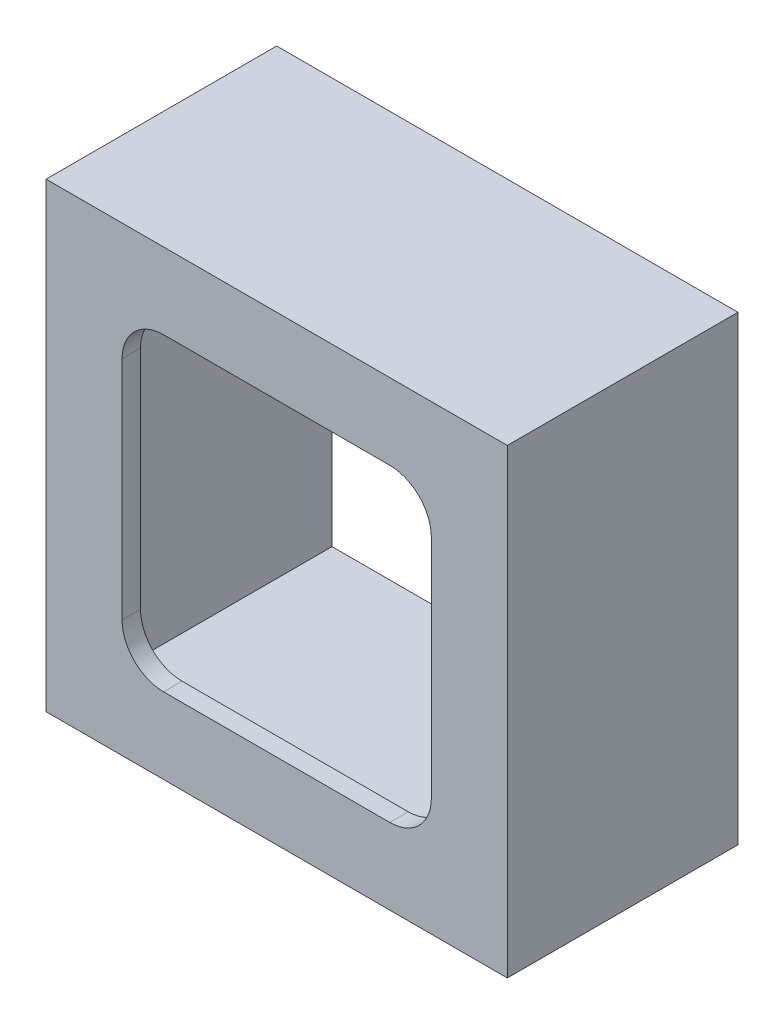
ISO-10303-21;
HEADER;
FILE_DESCRIPTION(('STEP AP214'),'2;1');
FILE_NAME('part.step','',(''),(''),'','','');
FILE_SCHEMA(('AUTOMOTIVE_DESIGN { 1 0 10303 214 1 1 1 1 }'));
ENDSEC;
DATA;
#1=APPLICATION_CONTEXT('core data for automotive mechanical design processes');
#2=APPLICATION_PROTOCOL_DEFINITION('international standard','automotive_design',2000,#1);
#3=PRODUCT_CONTEXT('',#1,'mechanical');
#4=PRODUCT('Part','Part','',(#3));
#5=PRODUCT_RELATED_PRODUCT_CATEGORY('part','',(#4));
#6=PRODUCT_DEFINITION_FORMATION('','',#4);
#7=PRODUCT_DEFINITION_CONTEXT('part definition',#1,'design');
#8=PRODUCT_DEFINITION('design','',#6,#7);
#9=PRODUCT_DEFINITION_SHAPE('','',#8);
#10=(LENGTH_UNIT() NAMED_UNIT(*) SI_UNIT(.MILLI.,.METRE.));
#11=(NAMED_UNIT(*) PLANE_ANGLE_UNIT() SI_UNIT($,.RADIAN.));
#12=(NAMED_UNIT(*) SI_UNIT($,.STERADIAN.) SOLID_ANGLE_UNIT());
#13=UNCERTAINTY_MEASURE_WITH_UNIT(LENGTH_MEASURE(1.E-05),#10,'distance_accuracy_value','');
#14=(GEOMETRIC_REPRESENTATION_CONTEXT(3) GLOBAL_UNCERTAINTY_ASSIGNED_CONTEXT((#13)) GLOBAL_UNIT_ASSIGNED_CONTEXT((#10,
#11,#12)) REPRESENTATION_CONTEXT('',''));
#15=CARTESIAN_POINT('',(0.,0.,0.));
#16=DIRECTION('',(0.,0.,1.));
#17=DIRECTION('',(1.,0.,0.));
#18=AXIS2_PLACEMENT_3D('',#15,#16,#17);
#19=CARTESIAN_POINT('',(25.,-25.,-72.7106781186548));
#20=DIRECTION('',(0.,-1.,0.));
#21=DIRECTION('',(0.,0.,-1.));
#22=AXIS2_PLACEMENT_3D('',#19,#20,#21);
#23=PLANE('',#22);
#24=DIRECTION('',(0.,0.,1.));
#25=VECTOR('',#24,1.);
#26=CARTESIAN_POINT('',(-25.,-25.,-72.7106781186548));
#27=LINE('',#26,#25);
#28=CARTESIAN_POINT('',(-25.,-25.,-25.));
#29=VERTEX_POINT('',#28);
#30=CARTESIAN_POINT('',(-25.,-25.,0.));
#31=VERTEX_POINT('',#30);
#32=EDGE_CURVE('E273',#29,#31,#27,.T.);
#33=ORIENTED_EDGE('',*,*,#32,.F.);
#34=DIRECTION('',(-1.,0.,0.));
#35=VECTOR('',#34,1.);
#36=CARTESIAN_POINT('',(25.,-25.,-25.));
#37=LINE('',#36,#35);
#38=CARTESIAN_POINT('',(25.,-25.,-25.));
#39=VERTEX_POINT('',#38);
#40=EDGE_CURVE('E195',#39,#29,#37,.T.);
#41=ORIENTED_EDGE('',*,*,#40,.F.);
#42=DIRECTION('',(0.,0.,1.));
#43=VECTOR('',#42,1.);
#44=CARTESIAN_POINT('',(25.,-25.,-72.7106781186548));
#45=LINE('',#44,#43);
#46=CARTESIAN_POINT('',(25.,-25.,0.));
#47=VERTEX_POINT('',#46);
#48=EDGE_CURVE('E278',#39,#47,#45,.T.);
#49=ORIENTED_EDGE('',*,*,#48,.T.);
#50=DIRECTION('',(1.,0.,0.));
#51=VECTOR('',#50,1.);
#52=CARTESIAN_POINT('',(25.,-25.,0.));
#53=LINE('',#52,#51);
#54=EDGE_CURVE('E264',#31,#47,#53,.T.);
#55=ORIENTED_EDGE('',*,*,#54,.F.);
#56=EDGE_LOOP('',(#33,#41,#49,#55));
#57=FACE_BOUND('',#56,.T.);
#58=ADVANCED_FACE('F39',(#57),#23,.T.);
#59=CARTESIAN_POINT('',(25.,25.,-72.7106781186548));
#60=DIRECTION('',(1.,0.,0.));
#61=DIRECTION('',(0.,0.,-1.));
#62=AXIS2_PLACEMENT_3D('',#59,#60,#61);
#63=PLANE('',#62);
#64=ORIENTED_EDGE('',*,*,#48,.F.);
#65=DIRECTION('',(0.,-1.,0.));
#66=VECTOR('',#65,1.);
#67=CARTESIAN_POINT('',(25.,25.,-25.));
#68=LINE('',#67,#66);
#69=CARTESIAN_POINT('',(25.,25.,-25.));
#70=VERTEX_POINT('',#69);
#71=EDGE_CURVE('E169',#70,#39,#68,.T.);
#72=ORIENTED_EDGE('',*,*,#71,.F.);
#73=DIRECTION('',(0.,0.,1.));
#74=VECTOR('',#73,1.);
#75=CARTESIAN_POINT('',(25.,25.,-72.7106781186548));
#76=LINE('',#75,#74);
#77=CARTESIAN_POINT('',(25.,25.,0.));
#78=VERTEX_POINT('',#77);
#79=EDGE_CURVE('E276',#70,#78,#76,.T.);
#80=ORIENTED_EDGE('',*,*,#79,.T.);
#81=DIRECTION('',(0.,1.,0.));
#82=VECTOR('',#81,1.);
#83=CARTESIAN_POINT('',(25.,25.,0.));
#84=LINE('',#83,#82);
#85=EDGE_CURVE('E267',#47,#78,#84,.T.);
#86=ORIENTED_EDGE('',*,*,#85,.F.);
#87=EDGE_LOOP('',(#64,#72,#80,#86));
#88=FACE_BOUND('',#87,.T.);
#89=ADVANCED_FACE('F295',(#88),#63,.T.);
#90=CARTESIAN_POINT('',(25.,25.,-72.7106781186548));
#91=DIRECTION('',(0.,1.,0.));
#92=DIRECTION('',(0.,0.,1.));
#93=AXIS2_PLACEMENT_3D('',#90,#91,#92);
#94=PLANE('',#93);
#95=ORIENTED_EDGE('',*,*,#79,.F.);
#96=DIRECTION('',(1.,0.,0.));
#97=VECTOR('',#96,1.);
#98=CARTESIAN_POINT('',(25.,25.,-25.));
#99=LINE('',#98,#97);
#100=CARTESIAN_POINT('',(-25.,25.,-25.));
#101=VERTEX_POINT('',#100);
#102=EDGE_CURVE('E201',#101,#70,#99,.T.);
#103=ORIENTED_EDGE('',*,*,#102,.F.);
#104=DIRECTION('',(0.,0.,1.));
#105=VECTOR('',#104,1.);
#106=CARTESIAN_POINT('',(-25.,25.,-72.7106781186548));
#107=LINE('',#106,#105);
#108=CARTESIAN_POINT('',(-25.,25.,0.));
#109=VERTEX_POINT('',#108);
#110=EDGE_CURVE('E274',#101,#109,#107,.T.);
#111=ORIENTED_EDGE('',*,*,#110,.T.);
#112=DIRECTION('',(-1.,0.,0.));
#113=VECTOR('',#112,1.);
#114=CARTESIAN_POINT('',(25.,25.,0.));
#115=LINE('',#114,#113);
#116=EDGE_CURVE('E270',#78,#109,#115,.T.);
#117=ORIENTED_EDGE('',*,*,#116,.F.);
#118=EDGE_LOOP('',(#95,#103,#111,#117));
#119=FACE_BOUND('',#118,.T.);
#120=ADVANCED_FACE('F290',(#119),#94,.T.);
#121=CARTESIAN_POINT('',(-25.,25.,-72.7106781186548));
#122=DIRECTION('',(-1.,0.,0.));
#123=DIRECTION('',(0.,0.,1.));
#124=AXIS2_PLACEMENT_3D('',#121,#122,#123);
#125=PLANE('',#124);
#126=ORIENTED_EDGE('',*,*,#110,.F.);
#127=DIRECTION('',(0.,1.,0.));
#128=VECTOR('',#127,1.);
#129=CARTESIAN_POINT('',(-25.,25.,-25.));
#130=LINE('',#129,#128);
#131=EDGE_CURVE('E198',#29,#101,#130,.T.);
#132=ORIENTED_EDGE('',*,*,#131,.F.);
#133=ORIENTED_EDGE('',*,*,#32,.T.);
#134=DIRECTION('',(0.,-1.,0.));
#135=VECTOR('',#134,1.);
#136=CARTESIAN_POINT('',(-25.,25.,0.));
#137=LINE('',#136,#135);
#138=EDGE_CURVE('E248',#109,#31,#137,.T.);
#139=ORIENTED_EDGE('',*,*,#138,.F.);
#140=EDGE_LOOP('',(#126,#132,#133,#139));
#141=FACE_BOUND('',#140,.T.);
#142=ADVANCED_FACE('F41',(#141),#125,.T.);
#143=CARTESIAN_POINT('',(0.,0.,0.));
#144=DIRECTION('',(0.,0.,-1.));
#145=DIRECTION('',(-1.,0.,0.));
#146=AXIS2_PLACEMENT_3D('',#143,#144,#145);
#147=PLANE('',#146);
#148=DIRECTION('',(0.,-1.,0.));
#149=VECTOR('',#148,1.);
#150=CARTESIAN_POINT('',(-16.7634559672906,12.2634559672906,0.));
#151=LINE('',#150,#149);
#152=CARTESIAN_POINT('',(-16.7634559672906,12.2634559672906,0.));
#153=VERTEX_POINT('',#152);
#154=CARTESIAN_POINT('',(-16.7634559672906,-12.2634559672906,0.));
#155=VERTEX_POINT('',#154);
#156=EDGE_CURVE('E224',#153,#155,#151,.T.);
#157=ORIENTED_EDGE('',*,*,#156,.F.);
#158=CARTESIAN_POINT('',(-12.2634559672906,12.2634559672906,0.));
#159=DIRECTION('',(0.,0.,1.));
#160=DIRECTION('',(1.,0.,0.));
#161=AXIS2_PLACEMENT_3D('',#158,#159,#160);
#162=CIRCLE('',#161,4.5);
#163=CARTESIAN_POINT('',(-12.2634559672906,16.7634559672906,0.));
#164=VERTEX_POINT('',#163);
#165=EDGE_CURVE('E203',#164,#153,#162,.T.);
#166=ORIENTED_EDGE('',*,*,#165,.F.);
#167=DIRECTION('',(-1.,0.,0.));
#168=VECTOR('',#167,1.);
#169=CARTESIAN_POINT('',(12.2634559672906,16.7634559672906,0.));
#170=LINE('',#169,#168);
#171=CARTESIAN_POINT('',(12.2634559672906,16.7634559672906,0.));
#172=VERTEX_POINT('',#171);
#173=EDGE_CURVE('E242',#172,#164,#170,.T.);
#174=ORIENTED_EDGE('',*,*,#173,.F.);
#175=CARTESIAN_POINT('',(12.2634559672906,12.2634559672906,0.));
#176=DIRECTION('',(0.,0.,1.));
#177=DIRECTION('',(1.,0.,0.));
#178=AXIS2_PLACEMENT_3D('',#175,#176,#177);
#179=CIRCLE('',#178,4.5);
#180=CARTESIAN_POINT('',(16.7634559672906,12.2634559672906,0.));
#181=VERTEX_POINT('',#180);
#182=EDGE_CURVE('E239',#181,#172,#179,.T.);
#183=ORIENTED_EDGE('',*,*,#182,.F.);
#184=DIRECTION('',(0.,1.,0.));
#185=VECTOR('',#184,1.);
#186=CARTESIAN_POINT('',(16.7634559672906,-12.2634559672906,0.));
#187=LINE('',#186,#185);
#188=CARTESIAN_POINT('',(16.7634559672906,-12.2634559672906,0.));
#189=VERTEX_POINT('',#188);
#190=EDGE_CURVE('E236',#189,#181,#187,.T.);
#191=ORIENTED_EDGE('',*,*,#190,.F.);
#192=CARTESIAN_POINT('',(12.2634559672906,-12.2634559672906,0.));
#193=DIRECTION('',(0.,0.,1.));
#194=DIRECTION('',(1.,0.,0.));
#195=AXIS2_PLACEMENT_3D('',#192,#193,#194);
#196=CIRCLE('',#195,4.5);
#197=CARTESIAN_POINT('',(12.2634559672906,-16.7634559672906,0.));
#198=VERTEX_POINT('',#197);
#199=EDGE_CURVE('E233',#198,#189,#196,.T.);
#200=ORIENTED_EDGE('',*,*,#199,.F.);
#201=DIRECTION('',(1.,0.,0.));
#202=VECTOR('',#201,1.);
#203=CARTESIAN_POINT('',(-12.2634559672906,-16.7634559672906,0.));
#204=LINE('',#203,#202);
#205=CARTESIAN_POINT('',(-12.2634559672906,-16.7634559672906,0.));
#206=VERTEX_POINT('',#205);
#207=EDGE_CURVE('E230',#206,#198,#204,.T.);
#208=ORIENTED_EDGE('',*,*,#207,.F.);
#209=CARTESIAN_POINT('',(-12.2634559672906,-12.2634559672906,0.));
#210=DIRECTION('',(0.,0.,1.));
#211=DIRECTION('',(1.,0.,0.));
#212=AXIS2_PLACEMENT_3D('',#209,#210,#211);
#213=CIRCLE('',#212,4.5);
#214=EDGE_CURVE('E227',#155,#206,#213,.T.);
#215=ORIENTED_EDGE('',*,*,#214,.F.);
#216=EDGE_LOOP('',(#157,#166,#174,#183,#191,#200,#208,#215));
#217=FACE_BOUND('',#216,.T.);
#218=ORIENTED_EDGE('',*,*,#138,.T.);
#219=ORIENTED_EDGE('',*,*,#54,.T.);
#220=ORIENTED_EDGE('',*,*,#85,.T.);
#221=ORIENTED_EDGE('',*,*,#116,.T.);
#222=EDGE_LOOP('',(#218,#219,#220,#221));
#223=FACE_BOUND('',#222,.T.);
#224=ADVANCED_FACE('F287',(#217,#223),#147,.F.);
#225=CARTESIAN_POINT('',(-16.7634559672906,12.2634559672906,-72.7106781186548));
#226=DIRECTION('',(-1.,0.,0.));
#227=DIRECTION('',(0.,0.,1.));
#228=AXIS2_PLACEMENT_3D('',#225,#226,#227);
#229=PLANE('',#228);
#230=DIRECTION('',(0.,0.,1.));
#231=VECTOR('',#230,1.);
#232=CARTESIAN_POINT('',(-16.7634559672906,-12.2634559672906,-72.7106781186548));
#233=LINE('',#232,#231);
#234=CARTESIAN_POINT('',(-16.7634559672906,-12.2634559672906,-2.));
#235=VERTEX_POINT('',#234);
#236=EDGE_CURVE('E259',#235,#155,#233,.T.);
#237=ORIENTED_EDGE('',*,*,#236,.F.);
#238=DIRECTION('',(0.,1.,0.));
#239=VECTOR('',#238,1.);
#240=CARTESIAN_POINT('',(-16.7634559672906,12.2634559672906,-2.));
#241=LINE('',#240,#239);
#242=CARTESIAN_POINT('',(-16.7634559672906,12.2634559672906,-2.));
#243=VERTEX_POINT('',#242);
#244=EDGE_CURVE('E43',#235,#243,#241,.T.);
#245=ORIENTED_EDGE('',*,*,#244,.T.);
#246=DIRECTION('',(0.,0.,1.));
#247=VECTOR('',#246,1.);
#248=CARTESIAN_POINT('',(-16.7634559672906,12.2634559672906,-72.7106781186548));
#249=LINE('',#248,#247);
#250=EDGE_CURVE('E245',#243,#153,#249,.T.);
#251=ORIENTED_EDGE('',*,*,#250,.T.);
#252=ORIENTED_EDGE('',*,*,#156,.T.);
#253=EDGE_LOOP('',(#237,#245,#251,#252));
#254=FACE_BOUND('',#253,.T.);
#255=ADVANCED_FACE('F306',(#254),#229,.F.);
#256=CARTESIAN_POINT('',(-12.2634559672906,-12.2634559672906,-72.7106781186548));
#257=DIRECTION('',(0.,0.,1.));
#258=DIRECTION('',(1.,0.,0.));
#259=AXIS2_PLACEMENT_3D('',#256,#257,#258);
#260=CYLINDRICAL_SURFACE('',#259,4.5);
#261=DIRECTION('',(0.,0.,1.));
#262=VECTOR('',#261,1.);
#263=CARTESIAN_POINT('',(-12.2634559672906,-16.7634559672906,-72.7106781186548));
#264=LINE('',#263,#262);
#265=CARTESIAN_POINT('',(-12.2634559672906,-16.7634559672906,-2.));
#266=VERTEX_POINT('',#265);
#267=EDGE_CURVE('E257',#266,#206,#264,.T.);
#268=ORIENTED_EDGE('',*,*,#267,.F.);
#269=CARTESIAN_POINT('',(-12.2634559672906,-12.2634559672906,-2.));
#270=DIRECTION('',(0.,0.,1.));
#271=DIRECTION('',(1.,0.,0.));
#272=AXIS2_PLACEMENT_3D('',#269,#270,#271);
#273=CIRCLE('',#272,4.5);
#274=EDGE_CURVE('E11',#266,#235,#273,.F.);
#275=ORIENTED_EDGE('',*,*,#274,.T.);
#276=ORIENTED_EDGE('',*,*,#236,.T.);
#277=ORIENTED_EDGE('',*,*,#214,.T.);
#278=EDGE_LOOP('',(#268,#275,#276,#277));
#279=FACE_BOUND('',#278,.T.);
#280=ADVANCED_FACE('F316',(#279),#260,.F.);
#281=CARTESIAN_POINT('',(-12.2634559672906,-16.7634559672906,-72.7106781186548));
#282=DIRECTION('',(0.,-1.,0.));
#283=DIRECTION('',(1.,0.,0.));
#284=AXIS2_PLACEMENT_3D('',#281,#282,#283);
#285=PLANE('',#284);
#286=DIRECTION('',(0.,0.,1.));
#287=VECTOR('',#286,1.);
#288=CARTESIAN_POINT('',(12.2634559672906,-16.7634559672906,-72.7106781186548));
#289=LINE('',#288,#287);
#290=CARTESIAN_POINT('',(12.2634559672906,-16.7634559672906,-2.));
#291=VERTEX_POINT('',#290);
#292=EDGE_CURVE('E255',#291,#198,#289,.T.);
#293=ORIENTED_EDGE('',*,*,#292,.F.);
#294=DIRECTION('',(-1.,0.,0.));
#295=VECTOR('',#294,1.);
#296=CARTESIAN_POINT('',(-12.2634559672906,-16.7634559672906,-2.));
#297=LINE('',#296,#295);
#298=EDGE_CURVE('E48',#291,#266,#297,.T.);
#299=ORIENTED_EDGE('',*,*,#298,.T.);
#300=ORIENTED_EDGE('',*,*,#267,.T.);
#301=ORIENTED_EDGE('',*,*,#207,.T.);
#302=EDGE_LOOP('',(#293,#299,#300,#301));
#303=FACE_BOUND('',#302,.T.);
#304=ADVANCED_FACE('F320',(#303),#285,.F.);
#305=CARTESIAN_POINT('',(12.2634559672906,-12.2634559672906,-72.7106781186548));
#306=DIRECTION('',(0.,0.,1.));
#307=DIRECTION('',(1.,0.,0.));
#308=AXIS2_PLACEMENT_3D('',#305,#306,#307);
#309=CYLINDRICAL_SURFACE('',#308,4.5);
#310=DIRECTION('',(0.,0.,1.));
#311=VECTOR('',#310,1.);
#312=CARTESIAN_POINT('',(16.7634559672906,-12.2634559672906,-72.7106781186548));
#313=LINE('',#312,#311);
#314=CARTESIAN_POINT('',(16.7634559672906,-12.2634559672906,-2.));
#315=VERTEX_POINT('',#314);
#316=EDGE_CURVE('E253',#315,#189,#313,.T.);
#317=ORIENTED_EDGE('',*,*,#316,.F.);
#318=CARTESIAN_POINT('',(12.2634559672906,-12.2634559672906,-2.));
#319=DIRECTION('',(0.,0.,1.));
#320=DIRECTION('',(1.,0.,0.));
#321=AXIS2_PLACEMENT_3D('',#318,#319,#320);
#322=CIRCLE('',#321,4.5);
#323=EDGE_CURVE('E207',#315,#291,#322,.F.);
#324=ORIENTED_EDGE('',*,*,#323,.T.);
#325=ORIENTED_EDGE('',*,*,#292,.T.);
#326=ORIENTED_EDGE('',*,*,#199,.T.);
#327=EDGE_LOOP('',(#317,#324,#325,#326));
#328=FACE_BOUND('',#327,.T.);
#329=ADVANCED_FACE('F324',(#328),#309,.F.);
#330=CARTESIAN_POINT('',(16.7634559672906,-12.2634559672906,-72.7106781186548));
#331=DIRECTION('',(1.,0.,0.));
#332=DIRECTION('',(0.,0.,-1.));
#333=AXIS2_PLACEMENT_3D('',#330,#331,#332);
#334=PLANE('',#333);
#335=DIRECTION('',(0.,0.,1.));
#336=VECTOR('',#335,1.);
#337=CARTESIAN_POINT('',(16.7634559672906,12.2634559672906,-72.7106781186548));
#338=LINE('',#337,#336);
#339=CARTESIAN_POINT('',(16.7634559672906,12.2634559672906,-2.));
#340=VERTEX_POINT('',#339);
#341=EDGE_CURVE('E251',#340,#181,#338,.T.);
#342=ORIENTED_EDGE('',*,*,#341,.F.);
#343=DIRECTION('',(0.,-1.,0.));
#344=VECTOR('',#343,1.);
#345=CARTESIAN_POINT('',(16.7634559672906,-12.2634559672906,-2.));
#346=LINE('',#345,#344);
#347=EDGE_CURVE('E210',#340,#315,#346,.T.);
#348=ORIENTED_EDGE('',*,*,#347,.T.);
#349=ORIENTED_EDGE('',*,*,#316,.T.);
#350=ORIENTED_EDGE('',*,*,#190,.T.);
#351=EDGE_LOOP('',(#342,#348,#349,#350));
#352=FACE_BOUND('',#351,.T.);
#353=ADVANCED_FACE('F328',(#352),#334,.F.);
#354=CARTESIAN_POINT('',(12.2634559672906,12.2634559672906,-72.7106781186548));
#355=DIRECTION('',(0.,0.,1.));
#356=DIRECTION('',(1.,0.,0.));
#357=AXIS2_PLACEMENT_3D('',#354,#355,#356);
#358=CYLINDRICAL_SURFACE('',#357,4.5);
#359=DIRECTION('',(0.,0.,1.));
#360=VECTOR('',#359,1.);
#361=CARTESIAN_POINT('',(12.2634559672906,16.7634559672906,-72.7106781186548));
#362=LINE('',#361,#360);
#363=CARTESIAN_POINT('',(12.2634559672906,16.7634559672906,-2.));
#364=VERTEX_POINT('',#363);
#365=EDGE_CURVE('E249',#364,#172,#362,.T.);
#366=ORIENTED_EDGE('',*,*,#365,.F.);
#367=CARTESIAN_POINT('',(12.2634559672906,12.2634559672906,-2.));
#368=DIRECTION('',(0.,0.,1.));
#369=DIRECTION('',(1.,0.,0.));
#370=AXIS2_PLACEMENT_3D('',#367,#368,#369);
#371=CIRCLE('',#370,4.5);
#372=EDGE_CURVE('E213',#364,#340,#371,.F.);
#373=ORIENTED_EDGE('',*,*,#372,.T.);
#374=ORIENTED_EDGE('',*,*,#341,.T.);
#375=ORIENTED_EDGE('',*,*,#182,.T.);
#376=EDGE_LOOP('',(#366,#373,#374,#375));
#377=FACE_BOUND('',#376,.T.);
#378=ADVANCED_FACE('F332',(#377),#358,.F.);
#379=CARTESIAN_POINT('',(12.2634559672906,16.7634559672906,-72.7106781186548));
#380=DIRECTION('',(0.,1.,0.));
#381=DIRECTION('',(-1.,0.,0.));
#382=AXIS2_PLACEMENT_3D('',#379,#380,#381);
#383=PLANE('',#382);
#384=DIRECTION('',(0.,0.,1.));
#385=VECTOR('',#384,1.);
#386=CARTESIAN_POINT('',(-12.2634559672906,16.7634559672906,-72.7106781186548));
#387=LINE('',#386,#385);
#388=CARTESIAN_POINT('',(-12.2634559672906,16.7634559672906,-2.));
#389=VERTEX_POINT('',#388);
#390=EDGE_CURVE('E246',#389,#164,#387,.T.);
#391=ORIENTED_EDGE('',*,*,#390,.F.);
#392=DIRECTION('',(1.,0.,0.));
#393=VECTOR('',#392,1.);
#394=CARTESIAN_POINT('',(12.2634559672906,16.7634559672906,-2.));
#395=LINE('',#394,#393);
#396=EDGE_CURVE('E216',#389,#364,#395,.T.);
#397=ORIENTED_EDGE('',*,*,#396,.T.);
#398=ORIENTED_EDGE('',*,*,#365,.T.);
#399=ORIENTED_EDGE('',*,*,#173,.T.);
#400=EDGE_LOOP('',(#391,#397,#398,#399));
#401=FACE_BOUND('',#400,.T.);
#402=ADVANCED_FACE('F312',(#401),#383,.F.);
#403=CARTESIAN_POINT('',(-12.2634559672906,12.2634559672906,-72.7106781186548));
#404=DIRECTION('',(0.,0.,1.));
#405=DIRECTION('',(1.,0.,0.));
#406=AXIS2_PLACEMENT_3D('',#403,#404,#405);
#407=CYLINDRICAL_SURFACE('',#406,4.5);
#408=ORIENTED_EDGE('',*,*,#250,.F.);
#409=CARTESIAN_POINT('',(-12.2634559672906,12.2634559672906,-2.));
#410=DIRECTION('',(0.,0.,1.));
#411=DIRECTION('',(1.,0.,0.));
#412=AXIS2_PLACEMENT_3D('',#409,#410,#411);
#413=CIRCLE('',#412,4.5);
#414=EDGE_CURVE('E219',#243,#389,#413,.F.);
#415=ORIENTED_EDGE('',*,*,#414,.T.);
#416=ORIENTED_EDGE('',*,*,#390,.T.);
#417=ORIENTED_EDGE('',*,*,#165,.T.);
#418=EDGE_LOOP('',(#408,#415,#416,#417));
#419=FACE_BOUND('',#418,.T.);
#420=ADVANCED_FACE('F308',(#419),#407,.F.);
#421=CARTESIAN_POINT('',(0.,0.,-2.00000000000001));
#422=DIRECTION('',(0.,0.,1.));
#423=DIRECTION('',(1.,0.,0.));
#424=AXIS2_PLACEMENT_3D('',#421,#422,#423);
#425=PLANE('',#424);
#426=DIRECTION('',(1.,0.,0.));
#427=VECTOR('',#426,1.);
#428=CARTESIAN_POINT('',(19.,19.,-2.00000000000001));
#429=LINE('',#428,#427);
#430=CARTESIAN_POINT('',(-19.,19.,-2.00000000000001));
#431=VERTEX_POINT('',#430);
#432=CARTESIAN_POINT('',(19.,19.,-2.00000000000001));
#433=VERTEX_POINT('',#432);
#434=EDGE_CURVE('E162',#431,#433,#429,.T.);
#435=ORIENTED_EDGE('',*,*,#434,.T.);
#436=DIRECTION('',(0.,-1.,0.));
#437=VECTOR('',#436,1.);
#438=CARTESIAN_POINT('',(19.,19.,-2.00000000000001));
#439=LINE('',#438,#437);
#440=CARTESIAN_POINT('',(19.,-19.,-2.00000000000001));
#441=VERTEX_POINT('',#440);
#442=EDGE_CURVE('E181',#433,#441,#439,.T.);
#443=ORIENTED_EDGE('',*,*,#442,.T.);
#444=DIRECTION('',(-1.,0.,0.));
#445=VECTOR('',#444,1.);
#446=CARTESIAN_POINT('',(19.,-19.,-2.00000000000001));
#447=LINE('',#446,#445);
#448=CARTESIAN_POINT('',(-19.,-19.,-2.00000000000001));
#449=VERTEX_POINT('',#448);
#450=EDGE_CURVE('E168',#441,#449,#447,.T.);
#451=ORIENTED_EDGE('',*,*,#450,.T.);
#452=DIRECTION('',(0.,1.,0.));
#453=VECTOR('',#452,1.);
#454=CARTESIAN_POINT('',(-19.,19.,-2.00000000000001));
#455=LINE('',#454,#453);
#456=EDGE_CURVE('E184',#449,#431,#455,.T.);
#457=ORIENTED_EDGE('',*,*,#456,.T.);
#458=EDGE_LOOP('',(#435,#443,#451,#457));
#459=FACE_BOUND('',#458,.T.);
#460=ORIENTED_EDGE('',*,*,#244,.F.);
#461=ORIENTED_EDGE('',*,*,#274,.F.);
#462=ORIENTED_EDGE('',*,*,#298,.F.);
#463=ORIENTED_EDGE('',*,*,#323,.F.);
#464=ORIENTED_EDGE('',*,*,#347,.F.);
#465=ORIENTED_EDGE('',*,*,#372,.F.);
#466=ORIENTED_EDGE('',*,*,#396,.F.);
#467=ORIENTED_EDGE('',*,*,#414,.F.);
#468=EDGE_LOOP('',(#460,#461,#462,#463,#464,#465,#466,#467));
#469=FACE_BOUND('',#468,.T.);
#470=ADVANCED_FACE('F311',(#459,#469),#425,.F.);
#471=CARTESIAN_POINT('',(0.,0.,-25.));
#472=DIRECTION('',(0.,0.,-1.));
#473=DIRECTION('',(-1.,0.,0.));
#474=AXIS2_PLACEMENT_3D('',#471,#472,#473);
#475=PLANE('',#474);
#476=ORIENTED_EDGE('',*,*,#71,.T.);
#477=ORIENTED_EDGE('',*,*,#40,.T.);
#478=ORIENTED_EDGE('',*,*,#131,.T.);
#479=ORIENTED_EDGE('',*,*,#102,.T.);
#480=EDGE_LOOP('',(#476,#477,#478,#479));
#481=FACE_BOUND('',#480,.T.);
#482=DIRECTION('',(-1.,0.,0.));
#483=VECTOR('',#482,1.);
#484=CARTESIAN_POINT('',(19.,-19.,-25.));
#485=LINE('',#484,#483);
#486=CARTESIAN_POINT('',(19.,-19.,-25.));
#487=VERTEX_POINT('',#486);
#488=CARTESIAN_POINT('',(-19.,-19.,-25.));
#489=VERTEX_POINT('',#488);
#490=EDGE_CURVE('E161',#487,#489,#485,.T.);
#491=ORIENTED_EDGE('',*,*,#490,.F.);
#492=DIRECTION('',(0.,-1.,0.));
#493=VECTOR('',#492,1.);
#494=CARTESIAN_POINT('',(19.,19.,-25.));
#495=LINE('',#494,#493);
#496=CARTESIAN_POINT('',(19.,19.,-25.));
#497=VERTEX_POINT('',#496);
#498=EDGE_CURVE('E153',#497,#487,#495,.T.);
#499=ORIENTED_EDGE('',*,*,#498,.F.);
#500=DIRECTION('',(1.,0.,0.));
#501=VECTOR('',#500,1.);
#502=CARTESIAN_POINT('',(19.,19.,-25.));
#503=LINE('',#502,#501);
#504=CARTESIAN_POINT('',(-19.,19.,-25.));
#505=VERTEX_POINT('',#504);
#506=EDGE_CURVE('E177',#505,#497,#503,.T.);
#507=ORIENTED_EDGE('',*,*,#506,.F.);
#508=DIRECTION('',(0.,1.,0.));
#509=VECTOR('',#508,1.);
#510=CARTESIAN_POINT('',(-19.,19.,-25.));
#511=LINE('',#510,#509);
#512=EDGE_CURVE('E175',#489,#505,#511,.T.);
#513=ORIENTED_EDGE('',*,*,#512,.F.);
#514=EDGE_LOOP('',(#491,#499,#507,#513));
#515=FACE_BOUND('',#514,.T.);
#516=ADVANCED_FACE('F173',(#481,#515),#475,.T.);
#517=CARTESIAN_POINT('',(19.,19.,-25.));
#518=DIRECTION('',(-1.,0.,0.));
#519=DIRECTION('',(0.,0.,1.));
#520=AXIS2_PLACEMENT_3D('',#517,#518,#519);
#521=PLANE('',#520);
#522=ORIENTED_EDGE('',*,*,#442,.F.);
#523=DIRECTION('',(0.,0.,1.));
#524=VECTOR('',#523,1.);
#525=CARTESIAN_POINT('',(19.,19.,-25.));
#526=LINE('',#525,#524);
#527=EDGE_CURVE('E56',#497,#433,#526,.T.);
#528=ORIENTED_EDGE('',*,*,#527,.F.);
#529=ORIENTED_EDGE('',*,*,#498,.T.);
#530=DIRECTION('',(0.,0.,1.));
#531=VECTOR('',#530,1.);
#532=CARTESIAN_POINT('',(19.,-19.,-25.));
#533=LINE('',#532,#531);
#534=EDGE_CURVE('E156',#487,#441,#533,.T.);
#535=ORIENTED_EDGE('',*,*,#534,.T.);
#536=EDGE_LOOP('',(#522,#528,#529,#535));
#537=FACE_BOUND('',#536,.T.);
#538=ADVANCED_FACE('F155',(#537),#521,.T.);
#539=CARTESIAN_POINT('',(19.,-19.,-25.));
#540=DIRECTION('',(0.,1.,0.));
#541=DIRECTION('',(0.,0.,1.));
#542=AXIS2_PLACEMENT_3D('',#539,#540,#541);
#543=PLANE('',#542);
#544=ORIENTED_EDGE('',*,*,#450,.F.);
#545=ORIENTED_EDGE('',*,*,#534,.F.);
#546=ORIENTED_EDGE('',*,*,#490,.T.);
#547=DIRECTION('',(0.,0.,1.));
#548=VECTOR('',#547,1.);
#549=CARTESIAN_POINT('',(-19.,-19.,-25.));
#550=LINE('',#549,#548);
#551=EDGE_CURVE('E170',#489,#449,#550,.T.);
#552=ORIENTED_EDGE('',*,*,#551,.T.);
#553=EDGE_LOOP('',(#544,#545,#546,#552));
#554=FACE_BOUND('',#553,.T.);
#555=ADVANCED_FACE('F165',(#554),#543,.T.);
#556=CARTESIAN_POINT('',(-19.,19.,-25.));
#557=DIRECTION('',(1.,0.,0.));
#558=DIRECTION('',(0.,0.,-1.));
#559=AXIS2_PLACEMENT_3D('',#556,#557,#558);
#560=PLANE('',#559);
#561=ORIENTED_EDGE('',*,*,#456,.F.);
#562=ORIENTED_EDGE('',*,*,#551,.F.);
#563=ORIENTED_EDGE('',*,*,#512,.T.);
#564=DIRECTION('',(0.,0.,1.));
#565=VECTOR('',#564,1.);
#566=CARTESIAN_POINT('',(-19.,19.,-25.));
#567=LINE('',#566,#565);
#568=EDGE_CURVE('E190',#505,#431,#567,.T.);
#569=ORIENTED_EDGE('',*,*,#568,.T.);
#570=EDGE_LOOP('',(#561,#562,#563,#569));
#571=FACE_BOUND('',#570,.T.);
#572=ADVANCED_FACE('F349',(#571),#560,.T.);
#573=CARTESIAN_POINT('',(19.,19.,-25.));
#574=DIRECTION('',(0.,-1.,0.));
#575=DIRECTION('',(0.,0.,-1.));
#576=AXIS2_PLACEMENT_3D('',#573,#574,#575);
#577=PLANE('',#576);
#578=ORIENTED_EDGE('',*,*,#434,.F.);
#579=ORIENTED_EDGE('',*,*,#568,.F.);
#580=ORIENTED_EDGE('',*,*,#506,.T.);
#581=ORIENTED_EDGE('',*,*,#527,.T.);
#582=EDGE_LOOP('',(#578,#579,#580,#581));
#583=FACE_BOUND('',#582,.T.);
#584=ADVANCED_FACE('F352',(#583),#577,.T.);
#585=CLOSED_SHELL('',(#58,#89,#120,#142,#224,#255,#280,#304,#329,#353,#378,#402,#420,#470,#516,
#538,#555,#572,#584));
#586=MANIFOLD_SOLID_BREP('B2',#585);
#587=ADVANCED_BREP_SHAPE_REPRESENTATION('',(#18,#586),#14);
#588=SHAPE_DEFINITION_REPRESENTATION(#9,#587);
ENDSEC;
END-ISO-10303-21;
